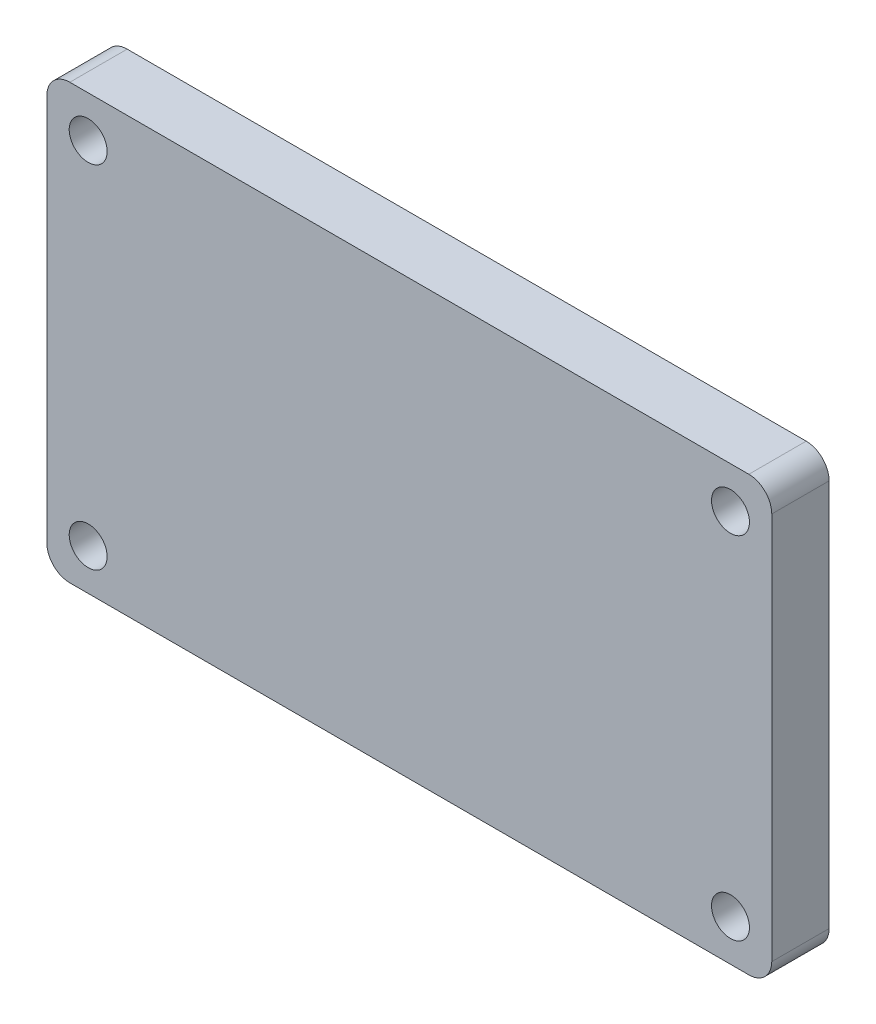
ISO-10303-21;
HEADER;
FILE_DESCRIPTION(('STEP AP214'),'2;1');
FILE_NAME('part.step','',(''),(''),'','','');
FILE_SCHEMA(('AUTOMOTIVE_DESIGN { 1 0 10303 214 1 1 1 1 }'));
ENDSEC;
DATA;
#1=APPLICATION_CONTEXT('core data for automotive mechanical design processes');
#2=APPLICATION_PROTOCOL_DEFINITION('international standard','automotive_design',2000,#1);
#3=PRODUCT_CONTEXT('',#1,'mechanical');
#4=PRODUCT('Part','Part','',(#3));
#5=PRODUCT_RELATED_PRODUCT_CATEGORY('part','',(#4));
#6=PRODUCT_DEFINITION_FORMATION('','',#4);
#7=PRODUCT_DEFINITION_CONTEXT('part definition',#1,'design');
#8=PRODUCT_DEFINITION('design','',#6,#7);
#9=PRODUCT_DEFINITION_SHAPE('','',#8);
#10=(LENGTH_UNIT() NAMED_UNIT(*) SI_UNIT(.MILLI.,.METRE.));
#11=(NAMED_UNIT(*) PLANE_ANGLE_UNIT() SI_UNIT($,.RADIAN.));
#12=(NAMED_UNIT(*) SI_UNIT($,.STERADIAN.) SOLID_ANGLE_UNIT());
#13=UNCERTAINTY_MEASURE_WITH_UNIT(LENGTH_MEASURE(1.E-05),#10,'distance_accuracy_value','');
#14=(GEOMETRIC_REPRESENTATION_CONTEXT(3) GLOBAL_UNCERTAINTY_ASSIGNED_CONTEXT((#13)) GLOBAL_UNIT_ASSIGNED_CONTEXT((#10,
#11,#12)) REPRESENTATION_CONTEXT('',''));
#15=CARTESIAN_POINT('',(0.,0.,0.));
#16=DIRECTION('',(0.,0.,1.));
#17=DIRECTION('',(1.,0.,0.));
#18=AXIS2_PLACEMENT_3D('',#15,#16,#17);
#19=CARTESIAN_POINT('',(0.,-24.003,6.35));
#20=DIRECTION('',(0.,1.,0.));
#21=DIRECTION('',(0.,0.,1.));
#22=AXIS2_PLACEMENT_3D('',#19,#20,#21);
#23=PLANE('',#22);
#24=DIRECTION('',(1.,0.,0.));
#25=VECTOR('',#24,1.);
#26=CARTESIAN_POINT('',(0.,-24.003,0.));
#27=LINE('',#26,#25);
#28=CARTESIAN_POINT('',(-37.592,-24.003,0.));
#29=VERTEX_POINT('',#28);
#30=CARTESIAN_POINT('',(37.592,-24.003,0.));
#31=VERTEX_POINT('',#30);
#32=EDGE_CURVE('E135',#29,#31,#27,.T.);
#33=ORIENTED_EDGE('',*,*,#32,.T.);
#34=DIRECTION('',(0.,0.,-1.));
#35=VECTOR('',#34,1.);
#36=CARTESIAN_POINT('',(37.592,-24.003,6.35));
#37=LINE('',#36,#35);
#38=CARTESIAN_POINT('',(37.592,-24.003,6.35));
#39=VERTEX_POINT('',#38);
#40=EDGE_CURVE('E113',#31,#39,#37,.F.);
#41=ORIENTED_EDGE('',*,*,#40,.T.);
#42=DIRECTION('',(1.,0.,0.));
#43=VECTOR('',#42,1.);
#44=CARTESIAN_POINT('',(0.,-24.003,6.35));
#45=LINE('',#44,#43);
#46=CARTESIAN_POINT('',(-37.592,-24.003,6.35));
#47=VERTEX_POINT('',#46);
#48=EDGE_CURVE('E145',#47,#39,#45,.T.);
#49=ORIENTED_EDGE('',*,*,#48,.F.);
#50=DIRECTION('',(0.,0.,-1.));
#51=VECTOR('',#50,1.);
#52=CARTESIAN_POINT('',(-37.592,-24.003,0.));
#53=LINE('',#52,#51);
#54=EDGE_CURVE('E118',#47,#29,#53,.T.);
#55=ORIENTED_EDGE('',*,*,#54,.T.);
#56=EDGE_LOOP('',(#33,#41,#49,#55));
#57=FACE_BOUND('',#56,.T.);
#58=ADVANCED_FACE('F43',(#57),#23,.F.);
#59=CARTESIAN_POINT('',(40.132,0.,6.35));
#60=DIRECTION('',(-1.,0.,0.));
#61=DIRECTION('',(0.,0.,1.));
#62=AXIS2_PLACEMENT_3D('',#59,#60,#61);
#63=PLANE('',#62);
#64=DIRECTION('',(0.,1.,0.));
#65=VECTOR('',#64,1.);
#66=CARTESIAN_POINT('',(40.132,0.,6.35));
#67=LINE('',#66,#65);
#68=CARTESIAN_POINT('',(40.132,-21.463,6.35));
#69=VERTEX_POINT('',#68);
#70=CARTESIAN_POINT('',(40.132,21.463,6.35));
#71=VERTEX_POINT('',#70);
#72=EDGE_CURVE('E128',#69,#71,#67,.T.);
#73=ORIENTED_EDGE('',*,*,#72,.F.);
#74=DIRECTION('',(0.,0.,-1.));
#75=VECTOR('',#74,1.);
#76=CARTESIAN_POINT('',(40.132,-21.463,6.35));
#77=LINE('',#76,#75);
#78=CARTESIAN_POINT('',(40.132,-21.463,0.));
#79=VERTEX_POINT('',#78);
#80=EDGE_CURVE('E112',#69,#79,#77,.T.);
#81=ORIENTED_EDGE('',*,*,#80,.T.);
#82=DIRECTION('',(0.,1.,0.));
#83=VECTOR('',#82,1.);
#84=CARTESIAN_POINT('',(40.132,0.,0.));
#85=LINE('',#84,#83);
#86=CARTESIAN_POINT('',(40.132,21.463,0.));
#87=VERTEX_POINT('',#86);
#88=EDGE_CURVE('E125',#79,#87,#85,.T.);
#89=ORIENTED_EDGE('',*,*,#88,.T.);
#90=DIRECTION('',(0.,0.,-1.));
#91=VECTOR('',#90,1.);
#92=CARTESIAN_POINT('',(40.132,21.463,6.35));
#93=LINE('',#92,#91);
#94=EDGE_CURVE('E130',#87,#71,#93,.F.);
#95=ORIENTED_EDGE('',*,*,#94,.T.);
#96=EDGE_LOOP('',(#73,#81,#89,#95));
#97=FACE_BOUND('',#96,.T.);
#98=ADVANCED_FACE('F124',(#97),#63,.F.);
#99=CARTESIAN_POINT('',(0.,24.003,6.35));
#100=DIRECTION('',(0.,1.,0.));
#101=DIRECTION('',(0.,0.,1.));
#102=AXIS2_PLACEMENT_3D('',#99,#100,#101);
#103=PLANE('',#102);
#104=DIRECTION('',(1.,0.,0.));
#105=VECTOR('',#104,1.);
#106=CARTESIAN_POINT('',(0.,24.003,6.35));
#107=LINE('',#106,#105);
#108=CARTESIAN_POINT('',(-37.592,24.003,6.35));
#109=VERTEX_POINT('',#108);
#110=CARTESIAN_POINT('',(37.592,24.003,6.35));
#111=VERTEX_POINT('',#110);
#112=EDGE_CURVE('E179',#109,#111,#107,.T.);
#113=ORIENTED_EDGE('',*,*,#112,.T.);
#114=DIRECTION('',(0.,0.,-1.));
#115=VECTOR('',#114,1.);
#116=CARTESIAN_POINT('',(37.592,24.003,0.));
#117=LINE('',#116,#115);
#118=CARTESIAN_POINT('',(37.592,24.003,0.));
#119=VERTEX_POINT('',#118);
#120=EDGE_CURVE('E164',#111,#119,#117,.T.);
#121=ORIENTED_EDGE('',*,*,#120,.T.);
#122=DIRECTION('',(1.,0.,0.));
#123=VECTOR('',#122,1.);
#124=CARTESIAN_POINT('',(0.,24.003,0.));
#125=LINE('',#124,#123);
#126=CARTESIAN_POINT('',(-37.592,24.003,0.));
#127=VERTEX_POINT('',#126);
#128=EDGE_CURVE('E134',#127,#119,#125,.T.);
#129=ORIENTED_EDGE('',*,*,#128,.F.);
#130=DIRECTION('',(0.,0.,-1.));
#131=VECTOR('',#130,1.);
#132=CARTESIAN_POINT('',(-37.592,24.003,6.35));
#133=LINE('',#132,#131);
#134=EDGE_CURVE('E162',#127,#109,#133,.F.);
#135=ORIENTED_EDGE('',*,*,#134,.T.);
#136=EDGE_LOOP('',(#113,#121,#129,#135));
#137=FACE_BOUND('',#136,.T.);
#138=ADVANCED_FACE('F188',(#137),#103,.T.);
#139=CARTESIAN_POINT('',(-40.132,0.,6.35));
#140=DIRECTION('',(-1.,0.,0.));
#141=DIRECTION('',(0.,0.,1.));
#142=AXIS2_PLACEMENT_3D('',#139,#140,#141);
#143=PLANE('',#142);
#144=DIRECTION('',(0.,1.,0.));
#145=VECTOR('',#144,1.);
#146=CARTESIAN_POINT('',(-40.132,0.,0.));
#147=LINE('',#146,#145);
#148=CARTESIAN_POINT('',(-40.132,-21.463,0.));
#149=VERTEX_POINT('',#148);
#150=CARTESIAN_POINT('',(-40.132,21.463,0.));
#151=VERTEX_POINT('',#150);
#152=EDGE_CURVE('E137',#149,#151,#147,.T.);
#153=ORIENTED_EDGE('',*,*,#152,.F.);
#154=DIRECTION('',(0.,0.,-1.));
#155=VECTOR('',#154,1.);
#156=CARTESIAN_POINT('',(-40.132,-21.463,6.35));
#157=LINE('',#156,#155);
#158=CARTESIAN_POINT('',(-40.132,-21.463,6.35));
#159=VERTEX_POINT('',#158);
#160=EDGE_CURVE('E11',#149,#159,#157,.F.);
#161=ORIENTED_EDGE('',*,*,#160,.T.);
#162=DIRECTION('',(0.,1.,0.));
#163=VECTOR('',#162,1.);
#164=CARTESIAN_POINT('',(-40.132,0.,6.35));
#165=LINE('',#164,#163);
#166=CARTESIAN_POINT('',(-40.132,21.463,6.35));
#167=VERTEX_POINT('',#166);
#168=EDGE_CURVE('E146',#159,#167,#165,.T.);
#169=ORIENTED_EDGE('',*,*,#168,.T.);
#170=DIRECTION('',(0.,0.,-1.));
#171=VECTOR('',#170,1.);
#172=CARTESIAN_POINT('',(-40.132,21.463,6.35));
#173=LINE('',#172,#171);
#174=EDGE_CURVE('E51',#167,#151,#173,.T.);
#175=ORIENTED_EDGE('',*,*,#174,.T.);
#176=EDGE_LOOP('',(#153,#161,#169,#175));
#177=FACE_BOUND('',#176,.T.);
#178=ADVANCED_FACE('F168',(#177),#143,.T.);
#179=CARTESIAN_POINT('',(0.,0.,6.35));
#180=DIRECTION('',(0.,0.,1.));
#181=DIRECTION('',(1.,0.,0.));
#182=AXIS2_PLACEMENT_3D('',#179,#180,#181);
#183=PLANE('',#182);
#184=CARTESIAN_POINT('',(-35.56,-19.431,6.35));
#185=DIRECTION('',(0.,0.,1.));
#186=DIRECTION('',(1.,0.,0.));
#187=AXIS2_PLACEMENT_3D('',#184,#185,#186);
#188=CIRCLE('',#187,2.10000011800001);
#189=CARTESIAN_POINT('',(-33.459999882,-19.431,6.35));
#190=VERTEX_POINT('',#189);
#191=EDGE_CURVE('E324',#190,#190,#188,.T.);
#192=ORIENTED_EDGE('',*,*,#191,.F.);
#193=EDGE_LOOP('',(#192));
#194=FACE_BOUND('',#193,.T.);
#195=CARTESIAN_POINT('',(35.56,19.431,6.35));
#196=DIRECTION('',(0.,0.,1.));
#197=DIRECTION('',(1.,0.,0.));
#198=AXIS2_PLACEMENT_3D('',#195,#196,#197);
#199=CIRCLE('',#198,2.10000011800001);
#200=CARTESIAN_POINT('',(37.660000118,19.431,6.35));
#201=VERTEX_POINT('',#200);
#202=EDGE_CURVE('E336',#201,#201,#199,.T.);
#203=ORIENTED_EDGE('',*,*,#202,.F.);
#204=EDGE_LOOP('',(#203));
#205=FACE_BOUND('',#204,.T.);
#206=CARTESIAN_POINT('',(35.56,-19.431,6.35));
#207=DIRECTION('',(0.,0.,1.));
#208=DIRECTION('',(1.,0.,0.));
#209=AXIS2_PLACEMENT_3D('',#206,#207,#208);
#210=CIRCLE('',#209,2.10000011800001);
#211=CARTESIAN_POINT('',(37.660000118,-19.431,6.35));
#212=VERTEX_POINT('',#211);
#213=EDGE_CURVE('E331',#212,#212,#210,.T.);
#214=ORIENTED_EDGE('',*,*,#213,.F.);
#215=EDGE_LOOP('',(#214));
#216=FACE_BOUND('',#215,.T.);
#217=CARTESIAN_POINT('',(-35.56,19.431,6.35));
#218=DIRECTION('',(0.,0.,1.));
#219=DIRECTION('',(1.,0.,0.));
#220=AXIS2_PLACEMENT_3D('',#217,#218,#219);
#221=CIRCLE('',#220,2.10000011800001);
#222=CARTESIAN_POINT('',(-33.459999882,19.431,6.35));
#223=VERTEX_POINT('',#222);
#224=EDGE_CURVE('E182',#223,#223,#221,.T.);
#225=ORIENTED_EDGE('',*,*,#224,.F.);
#226=EDGE_LOOP('',(#225));
#227=FACE_BOUND('',#226,.T.);
#228=ORIENTED_EDGE('',*,*,#48,.T.);
#229=CARTESIAN_POINT('',(37.592,-21.463,6.35));
#230=DIRECTION('',(0.,0.,1.));
#231=DIRECTION('',(1.,0.,0.));
#232=AXIS2_PLACEMENT_3D('',#229,#230,#231);
#233=CIRCLE('',#232,2.54);
#234=EDGE_CURVE('E160',#39,#69,#233,.T.);
#235=ORIENTED_EDGE('',*,*,#234,.T.);
#236=ORIENTED_EDGE('',*,*,#72,.T.);
#237=CARTESIAN_POINT('',(37.592,21.463,6.35));
#238=DIRECTION('',(0.,0.,1.));
#239=DIRECTION('',(1.,0.,0.));
#240=AXIS2_PLACEMENT_3D('',#237,#238,#239);
#241=CIRCLE('',#240,2.54);
#242=EDGE_CURVE('E158',#71,#111,#241,.T.);
#243=ORIENTED_EDGE('',*,*,#242,.T.);
#244=ORIENTED_EDGE('',*,*,#112,.F.);
#245=CARTESIAN_POINT('',(-37.592,21.463,6.35));
#246=DIRECTION('',(0.,0.,1.));
#247=DIRECTION('',(1.,0.,0.));
#248=AXIS2_PLACEMENT_3D('',#245,#246,#247);
#249=CIRCLE('',#248,2.54);
#250=EDGE_CURVE('E58',#109,#167,#249,.T.);
#251=ORIENTED_EDGE('',*,*,#250,.T.);
#252=ORIENTED_EDGE('',*,*,#168,.F.);
#253=CARTESIAN_POINT('',(-37.592,-21.463,6.35));
#254=DIRECTION('',(0.,0.,1.));
#255=DIRECTION('',(1.,0.,0.));
#256=AXIS2_PLACEMENT_3D('',#253,#254,#255);
#257=CIRCLE('',#256,2.54);
#258=EDGE_CURVE('E156',#159,#47,#257,.T.);
#259=ORIENTED_EDGE('',*,*,#258,.T.);
#260=EDGE_LOOP('',(#228,#235,#236,#243,#244,#251,#252,#259));
#261=FACE_BOUND('',#260,.T.);
#262=ADVANCED_FACE('F193',(#194,#205,#216,#227,#261),#183,.T.);
#263=CARTESIAN_POINT('',(0.,0.,0.));
#264=DIRECTION('',(0.,0.,1.));
#265=DIRECTION('',(1.,0.,0.));
#266=AXIS2_PLACEMENT_3D('',#263,#264,#265);
#267=PLANE('',#266);
#268=CARTESIAN_POINT('',(-35.56,-19.431,0.));
#269=DIRECTION('',(0.,0.,1.));
#270=DIRECTION('',(1.,0.,0.));
#271=AXIS2_PLACEMENT_3D('',#268,#269,#270);
#272=CIRCLE('',#271,2.10000011800001);
#273=CARTESIAN_POINT('',(-33.459999882,-19.431,0.));
#274=VERTEX_POINT('',#273);
#275=EDGE_CURVE('E322',#274,#274,#272,.T.);
#276=ORIENTED_EDGE('',*,*,#275,.T.);
#277=EDGE_LOOP('',(#276));
#278=FACE_BOUND('',#277,.T.);
#279=CARTESIAN_POINT('',(35.56,19.431,0.));
#280=DIRECTION('',(0.,0.,1.));
#281=DIRECTION('',(1.,0.,0.));
#282=AXIS2_PLACEMENT_3D('',#279,#280,#281);
#283=CIRCLE('',#282,2.10000011800001);
#284=CARTESIAN_POINT('',(37.660000118,19.431,0.));
#285=VERTEX_POINT('',#284);
#286=EDGE_CURVE('E328',#285,#285,#283,.T.);
#287=ORIENTED_EDGE('',*,*,#286,.T.);
#288=EDGE_LOOP('',(#287));
#289=FACE_BOUND('',#288,.T.);
#290=CARTESIAN_POINT('',(35.56,-19.431,0.));
#291=DIRECTION('',(0.,0.,1.));
#292=DIRECTION('',(1.,0.,0.));
#293=AXIS2_PLACEMENT_3D('',#290,#291,#292);
#294=CIRCLE('',#293,2.10000011800001);
#295=CARTESIAN_POINT('',(37.660000118,-19.431,0.));
#296=VERTEX_POINT('',#295);
#297=EDGE_CURVE('E338',#296,#296,#294,.T.);
#298=ORIENTED_EDGE('',*,*,#297,.T.);
#299=EDGE_LOOP('',(#298));
#300=FACE_BOUND('',#299,.T.);
#301=CARTESIAN_POINT('',(-35.56,19.431,0.));
#302=DIRECTION('',(0.,0.,1.));
#303=DIRECTION('',(1.,0.,0.));
#304=AXIS2_PLACEMENT_3D('',#301,#302,#303);
#305=CIRCLE('',#304,2.10000011800001);
#306=CARTESIAN_POINT('',(-33.459999882,19.431,0.));
#307=VERTEX_POINT('',#306);
#308=EDGE_CURVE('E139',#307,#307,#305,.T.);
#309=ORIENTED_EDGE('',*,*,#308,.T.);
#310=EDGE_LOOP('',(#309));
#311=FACE_BOUND('',#310,.T.);
#312=ORIENTED_EDGE('',*,*,#88,.F.);
#313=CARTESIAN_POINT('',(37.592,-21.463,0.));
#314=DIRECTION('',(0.,0.,1.));
#315=DIRECTION('',(1.,0.,0.));
#316=AXIS2_PLACEMENT_3D('',#313,#314,#315);
#317=CIRCLE('',#316,2.54);
#318=EDGE_CURVE('E108',#79,#31,#317,.F.);
#319=ORIENTED_EDGE('',*,*,#318,.T.);
#320=ORIENTED_EDGE('',*,*,#32,.F.);
#321=CARTESIAN_POINT('',(-37.592,-21.463,0.));
#322=DIRECTION('',(0.,0.,1.));
#323=DIRECTION('',(1.,0.,0.));
#324=AXIS2_PLACEMENT_3D('',#321,#322,#323);
#325=CIRCLE('',#324,2.54);
#326=EDGE_CURVE('E149',#29,#149,#325,.F.);
#327=ORIENTED_EDGE('',*,*,#326,.T.);
#328=ORIENTED_EDGE('',*,*,#152,.T.);
#329=CARTESIAN_POINT('',(-37.592,21.463,0.));
#330=DIRECTION('',(0.,0.,1.));
#331=DIRECTION('',(1.,0.,0.));
#332=AXIS2_PLACEMENT_3D('',#329,#330,#331);
#333=CIRCLE('',#332,2.54);
#334=EDGE_CURVE('E129',#151,#127,#333,.F.);
#335=ORIENTED_EDGE('',*,*,#334,.T.);
#336=ORIENTED_EDGE('',*,*,#128,.T.);
#337=CARTESIAN_POINT('',(37.592,21.463,0.));
#338=DIRECTION('',(0.,0.,1.));
#339=DIRECTION('',(1.,0.,0.));
#340=AXIS2_PLACEMENT_3D('',#337,#338,#339);
#341=CIRCLE('',#340,2.54);
#342=EDGE_CURVE('E119',#119,#87,#341,.F.);
#343=ORIENTED_EDGE('',*,*,#342,.T.);
#344=EDGE_LOOP('',(#312,#319,#320,#327,#328,#335,#336,#343));
#345=FACE_BOUND('',#344,.T.);
#346=ADVANCED_FACE('F132',(#278,#289,#300,#311,#345),#267,.F.);
#347=CARTESIAN_POINT('',(-35.56,19.431,0.));
#348=DIRECTION('',(0.,0.,1.));
#349=DIRECTION('',(1.,0.,0.));
#350=AXIS2_PLACEMENT_3D('',#347,#348,#349);
#351=CYLINDRICAL_SURFACE('',#350,2.10000011800001);
#352=ORIENTED_EDGE('',*,*,#308,.F.);
#353=EDGE_LOOP('',(#352));
#354=FACE_BOUND('',#353,.T.);
#355=ORIENTED_EDGE('',*,*,#224,.T.);
#356=EDGE_LOOP('',(#355));
#357=FACE_BOUND('',#356,.T.);
#358=ADVANCED_FACE('F201',(#354,#357),#351,.F.);
#359=CARTESIAN_POINT('',(35.56,-19.431,0.));
#360=DIRECTION('',(0.,0.,1.));
#361=DIRECTION('',(1.,0.,0.));
#362=AXIS2_PLACEMENT_3D('',#359,#360,#361);
#363=CYLINDRICAL_SURFACE('',#362,2.10000011800001);
#364=ORIENTED_EDGE('',*,*,#297,.F.);
#365=EDGE_LOOP('',(#364));
#366=FACE_BOUND('',#365,.T.);
#367=ORIENTED_EDGE('',*,*,#213,.T.);
#368=EDGE_LOOP('',(#367));
#369=FACE_BOUND('',#368,.T.);
#370=ADVANCED_FACE('F262',(#366,#369),#363,.F.);
#371=CARTESIAN_POINT('',(35.56,19.431,0.));
#372=DIRECTION('',(0.,0.,1.));
#373=DIRECTION('',(1.,0.,0.));
#374=AXIS2_PLACEMENT_3D('',#371,#372,#373);
#375=CYLINDRICAL_SURFACE('',#374,2.10000011800001);
#376=ORIENTED_EDGE('',*,*,#286,.F.);
#377=EDGE_LOOP('',(#376));
#378=FACE_BOUND('',#377,.T.);
#379=ORIENTED_EDGE('',*,*,#202,.T.);
#380=EDGE_LOOP('',(#379));
#381=FACE_BOUND('',#380,.T.);
#382=ADVANCED_FACE('F252',(#378,#381),#375,.F.);
#383=CARTESIAN_POINT('',(-35.56,-19.431,0.));
#384=DIRECTION('',(0.,0.,1.));
#385=DIRECTION('',(1.,0.,0.));
#386=AXIS2_PLACEMENT_3D('',#383,#384,#385);
#387=CYLINDRICAL_SURFACE('',#386,2.10000011800001);
#388=ORIENTED_EDGE('',*,*,#275,.F.);
#389=EDGE_LOOP('',(#388));
#390=FACE_BOUND('',#389,.T.);
#391=ORIENTED_EDGE('',*,*,#191,.T.);
#392=EDGE_LOOP('',(#391));
#393=FACE_BOUND('',#392,.T.);
#394=ADVANCED_FACE('F219',(#390,#393),#387,.F.);
#395=CARTESIAN_POINT('',(37.592,-21.463,6.35));
#396=DIRECTION('',(0.,0.,-1.));
#397=DIRECTION('',(-1.,0.,0.));
#398=AXIS2_PLACEMENT_3D('',#395,#396,#397);
#399=CYLINDRICAL_SURFACE('',#398,2.54);
#400=ORIENTED_EDGE('',*,*,#234,.F.);
#401=ORIENTED_EDGE('',*,*,#40,.F.);
#402=ORIENTED_EDGE('',*,*,#318,.F.);
#403=ORIENTED_EDGE('',*,*,#80,.F.);
#404=EDGE_LOOP('',(#400,#401,#402,#403));
#405=FACE_BOUND('',#404,.T.);
#406=ADVANCED_FACE('F111',(#405),#399,.T.);
#407=CARTESIAN_POINT('',(37.592,21.463,6.35));
#408=DIRECTION('',(0.,0.,1.));
#409=DIRECTION('',(1.,0.,0.));
#410=AXIS2_PLACEMENT_3D('',#407,#408,#409);
#411=CYLINDRICAL_SURFACE('',#410,2.54);
#412=ORIENTED_EDGE('',*,*,#242,.F.);
#413=ORIENTED_EDGE('',*,*,#94,.F.);
#414=ORIENTED_EDGE('',*,*,#342,.F.);
#415=ORIENTED_EDGE('',*,*,#120,.F.);
#416=EDGE_LOOP('',(#412,#413,#414,#415));
#417=FACE_BOUND('',#416,.T.);
#418=ADVANCED_FACE('F192',(#417),#411,.T.);
#419=CARTESIAN_POINT('',(-37.592,-21.463,6.35));
#420=DIRECTION('',(0.,0.,1.));
#421=DIRECTION('',(1.,0.,0.));
#422=AXIS2_PLACEMENT_3D('',#419,#420,#421);
#423=CYLINDRICAL_SURFACE('',#422,2.54);
#424=ORIENTED_EDGE('',*,*,#258,.F.);
#425=ORIENTED_EDGE('',*,*,#160,.F.);
#426=ORIENTED_EDGE('',*,*,#326,.F.);
#427=ORIENTED_EDGE('',*,*,#54,.F.);
#428=EDGE_LOOP('',(#424,#425,#426,#427));
#429=FACE_BOUND('',#428,.T.);
#430=ADVANCED_FACE('F174',(#429),#423,.T.);
#431=CARTESIAN_POINT('',(-37.592,21.463,6.35));
#432=DIRECTION('',(0.,0.,-1.));
#433=DIRECTION('',(-1.,0.,0.));
#434=AXIS2_PLACEMENT_3D('',#431,#432,#433);
#435=CYLINDRICAL_SURFACE('',#434,2.54);
#436=ORIENTED_EDGE('',*,*,#250,.F.);
#437=ORIENTED_EDGE('',*,*,#134,.F.);
#438=ORIENTED_EDGE('',*,*,#334,.F.);
#439=ORIENTED_EDGE('',*,*,#174,.F.);
#440=EDGE_LOOP('',(#436,#437,#438,#439));
#441=FACE_BOUND('',#440,.T.);
#442=ADVANCED_FACE('F45',(#441),#435,.T.);
#443=CLOSED_SHELL('',(#58,#98,#138,#178,#262,#346,#358,#370,#382,#394,#406,#418,#430,#442));
#444=MANIFOLD_SOLID_BREP('B2',#443);
#445=ADVANCED_BREP_SHAPE_REPRESENTATION('',(#18,#444),#14);
#446=SHAPE_DEFINITION_REPRESENTATION(#9,#445);
ENDSEC;
END-ISO-10303-21;
